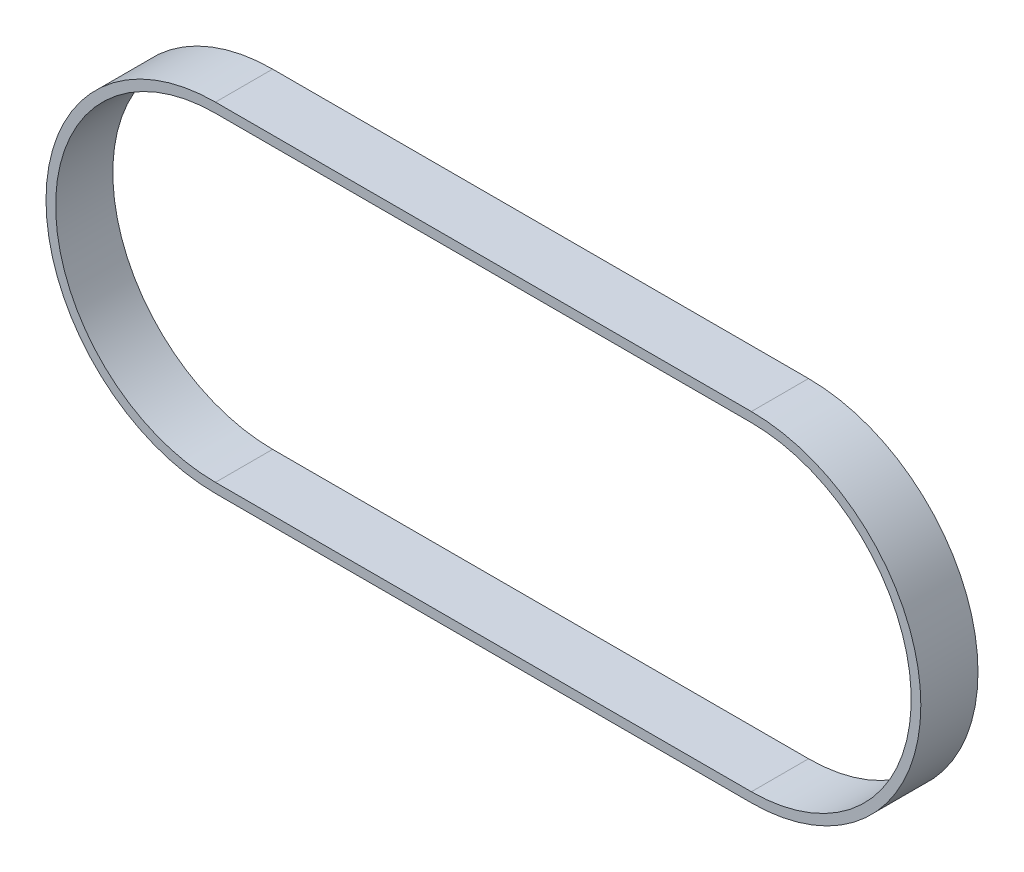
ISO-10303-21;
HEADER;
FILE_DESCRIPTION(('STEP AP214'),'2;1');
FILE_NAME('part.step','',(''),(''),'','','');
FILE_SCHEMA(('AUTOMOTIVE_DESIGN { 1 0 10303 214 1 1 1 1 }'));
ENDSEC;
DATA;
#1=APPLICATION_CONTEXT('core data for automotive mechanical design processes');
#2=APPLICATION_PROTOCOL_DEFINITION('international standard','automotive_design',2000,#1);
#3=PRODUCT_CONTEXT('',#1,'mechanical');
#4=PRODUCT('Part','Part','',(#3));
#5=PRODUCT_RELATED_PRODUCT_CATEGORY('part','',(#4));
#6=PRODUCT_DEFINITION_FORMATION('','',#4);
#7=PRODUCT_DEFINITION_CONTEXT('part definition',#1,'design');
#8=PRODUCT_DEFINITION('design','',#6,#7);
#9=PRODUCT_DEFINITION_SHAPE('','',#8);
#10=(LENGTH_UNIT() NAMED_UNIT(*) SI_UNIT(.MILLI.,.METRE.));
#11=(NAMED_UNIT(*) PLANE_ANGLE_UNIT() SI_UNIT($,.RADIAN.));
#12=(NAMED_UNIT(*) SI_UNIT($,.STERADIAN.) SOLID_ANGLE_UNIT());
#13=UNCERTAINTY_MEASURE_WITH_UNIT(LENGTH_MEASURE(1.E-05),#10,'distance_accuracy_value','');
#14=(GEOMETRIC_REPRESENTATION_CONTEXT(3) GLOBAL_UNCERTAINTY_ASSIGNED_CONTEXT((#13)) GLOBAL_UNIT_ASSIGNED_CONTEXT((#10,
#11,#12)) REPRESENTATION_CONTEXT('',''));
#15=CARTESIAN_POINT('',(0.,0.,0.));
#16=DIRECTION('',(0.,0.,1.));
#17=DIRECTION('',(1.,0.,0.));
#18=AXIS2_PLACEMENT_3D('',#15,#16,#17);
#19=CARTESIAN_POINT('',(-22.5,0.,4.8));
#20=DIRECTION('',(0.,0.,-1.));
#21=DIRECTION('',(-1.,0.,0.));
#22=AXIS2_PLACEMENT_3D('',#19,#20,#21);
#23=CYLINDRICAL_SURFACE('',#22,13.42);
#24=CARTESIAN_POINT('',(-22.5,0.,0.));
#25=DIRECTION('',(0.,0.,1.));
#26=DIRECTION('',(1.,0.,0.));
#27=AXIS2_PLACEMENT_3D('',#24,#25,#26);
#28=CIRCLE('',#27,13.42);
#29=CARTESIAN_POINT('',(-22.5,13.42,0.));
#30=VERTEX_POINT('',#29);
#31=CARTESIAN_POINT('',(-22.5,-13.42,0.));
#32=VERTEX_POINT('',#31);
#33=EDGE_CURVE('E199',#30,#32,#28,.T.);
#34=ORIENTED_EDGE('',*,*,#33,.F.);
#35=DIRECTION('',(0.,0.,-1.));
#36=VECTOR('',#35,1.);
#37=CARTESIAN_POINT('',(-22.5,13.42,4.8));
#38=LINE('',#37,#36);
#39=CARTESIAN_POINT('',(-22.5,13.42,4.8));
#40=VERTEX_POINT('',#39);
#41=EDGE_CURVE('E88',#40,#30,#38,.T.);
#42=ORIENTED_EDGE('',*,*,#41,.F.);
#43=CARTESIAN_POINT('',(-22.5,0.,4.8));
#44=DIRECTION('',(0.,0.,1.));
#45=DIRECTION('',(1.,0.,0.));
#46=AXIS2_PLACEMENT_3D('',#43,#44,#45);
#47=CIRCLE('',#46,13.42);
#48=CARTESIAN_POINT('',(-22.5,-13.42,4.8));
#49=VERTEX_POINT('',#48);
#50=EDGE_CURVE('E190',#40,#49,#47,.T.);
#51=ORIENTED_EDGE('',*,*,#50,.T.);
#52=DIRECTION('',(0.,0.,-1.));
#53=VECTOR('',#52,1.);
#54=CARTESIAN_POINT('',(-22.5,-13.42,4.8));
#55=LINE('',#54,#53);
#56=EDGE_CURVE('E95',#49,#32,#55,.T.);
#57=ORIENTED_EDGE('',*,*,#56,.T.);
#58=EDGE_LOOP('',(#34,#42,#51,#57));
#59=FACE_BOUND('',#58,.T.);
#60=ADVANCED_FACE('F80',(#59),#23,.F.);
#61=CARTESIAN_POINT('',(22.5,-13.42,4.8));
#62=DIRECTION('',(0.,1.,0.));
#63=DIRECTION('',(-1.,0.,0.));
#64=AXIS2_PLACEMENT_3D('',#61,#62,#63);
#65=PLANE('',#64);
#66=DIRECTION('',(1.,0.,0.));
#67=VECTOR('',#66,1.);
#68=CARTESIAN_POINT('',(22.5,-13.42,0.));
#69=LINE('',#68,#67);
#70=CARTESIAN_POINT('',(22.5,-13.42,0.));
#71=VERTEX_POINT('',#70);
#72=EDGE_CURVE('E188',#32,#71,#69,.T.);
#73=ORIENTED_EDGE('',*,*,#72,.F.);
#74=ORIENTED_EDGE('',*,*,#56,.F.);
#75=DIRECTION('',(1.,0.,0.));
#76=VECTOR('',#75,1.);
#77=CARTESIAN_POINT('',(22.5,-13.42,4.8));
#78=LINE('',#77,#76);
#79=CARTESIAN_POINT('',(22.5,-13.42,4.8));
#80=VERTEX_POINT('',#79);
#81=EDGE_CURVE('E192',#49,#80,#78,.T.);
#82=ORIENTED_EDGE('',*,*,#81,.T.);
#83=DIRECTION('',(0.,0.,-1.));
#84=VECTOR('',#83,1.);
#85=CARTESIAN_POINT('',(22.5,-13.42,4.8));
#86=LINE('',#85,#84);
#87=EDGE_CURVE('E194',#80,#71,#86,.T.);
#88=ORIENTED_EDGE('',*,*,#87,.T.);
#89=EDGE_LOOP('',(#73,#74,#82,#88));
#90=FACE_BOUND('',#89,.T.);
#91=ADVANCED_FACE('F215',(#90),#65,.T.);
#92=CARTESIAN_POINT('',(22.5,0.,4.8));
#93=DIRECTION('',(0.,0.,-1.));
#94=DIRECTION('',(-1.,0.,0.));
#95=AXIS2_PLACEMENT_3D('',#92,#93,#94);
#96=CYLINDRICAL_SURFACE('',#95,13.42);
#97=CARTESIAN_POINT('',(22.5,0.,0.));
#98=DIRECTION('',(0.,0.,1.));
#99=DIRECTION('',(1.,0.,0.));
#100=AXIS2_PLACEMENT_3D('',#97,#98,#99);
#101=CIRCLE('',#100,13.42);
#102=CARTESIAN_POINT('',(22.5,13.42,0.));
#103=VERTEX_POINT('',#102);
#104=EDGE_CURVE('E102',#71,#103,#101,.T.);
#105=ORIENTED_EDGE('',*,*,#104,.F.);
#106=ORIENTED_EDGE('',*,*,#87,.F.);
#107=CARTESIAN_POINT('',(22.5,0.,4.8));
#108=DIRECTION('',(0.,0.,1.));
#109=DIRECTION('',(1.,0.,0.));
#110=AXIS2_PLACEMENT_3D('',#107,#108,#109);
#111=CIRCLE('',#110,13.42);
#112=CARTESIAN_POINT('',(22.5,13.42,4.8));
#113=VERTEX_POINT('',#112);
#114=EDGE_CURVE('E185',#80,#113,#111,.T.);
#115=ORIENTED_EDGE('',*,*,#114,.T.);
#116=DIRECTION('',(0.,0.,-1.));
#117=VECTOR('',#116,1.);
#118=CARTESIAN_POINT('',(22.5,13.42,4.8));
#119=LINE('',#118,#117);
#120=EDGE_CURVE('E12',#113,#103,#119,.T.);
#121=ORIENTED_EDGE('',*,*,#120,.T.);
#122=EDGE_LOOP('',(#105,#106,#115,#121));
#123=FACE_BOUND('',#122,.T.);
#124=ADVANCED_FACE('F218',(#123),#96,.F.);
#125=CARTESIAN_POINT('',(22.5,13.42,4.8));
#126=DIRECTION('',(0.,-1.,0.));
#127=DIRECTION('',(1.,0.,0.));
#128=AXIS2_PLACEMENT_3D('',#125,#126,#127);
#129=PLANE('',#128);
#130=DIRECTION('',(-1.,0.,0.));
#131=VECTOR('',#130,1.);
#132=CARTESIAN_POINT('',(22.5,13.42,0.));
#133=LINE('',#132,#131);
#134=EDGE_CURVE('E196',#103,#30,#133,.T.);
#135=ORIENTED_EDGE('',*,*,#134,.F.);
#136=ORIENTED_EDGE('',*,*,#120,.F.);
#137=DIRECTION('',(-1.,0.,0.));
#138=VECTOR('',#137,1.);
#139=CARTESIAN_POINT('',(22.5,13.42,4.8));
#140=LINE('',#139,#138);
#141=EDGE_CURVE('E187',#113,#40,#140,.T.);
#142=ORIENTED_EDGE('',*,*,#141,.T.);
#143=ORIENTED_EDGE('',*,*,#41,.T.);
#144=EDGE_LOOP('',(#135,#136,#142,#143));
#145=FACE_BOUND('',#144,.T.);
#146=ADVANCED_FACE('F208',(#145),#129,.T.);
#147=CARTESIAN_POINT('',(22.5,0.,4.8));
#148=DIRECTION('',(0.,0.,1.));
#149=DIRECTION('',(1.,0.,0.));
#150=AXIS2_PLACEMENT_3D('',#147,#148,#149);
#151=PLANE('',#150);
#152=ORIENTED_EDGE('',*,*,#141,.F.);
#153=ORIENTED_EDGE('',*,*,#114,.F.);
#154=ORIENTED_EDGE('',*,*,#81,.F.);
#155=ORIENTED_EDGE('',*,*,#50,.F.);
#156=EDGE_LOOP('',(#152,#153,#154,#155));
#157=FACE_BOUND('',#156,.T.);
#158=CARTESIAN_POINT('',(22.5,0.,4.8));
#159=DIRECTION('',(0.,0.,1.));
#160=DIRECTION('',(1.,0.,0.));
#161=AXIS2_PLACEMENT_3D('',#158,#159,#160);
#162=CIRCLE('',#161,14.23);
#163=CARTESIAN_POINT('',(22.5,-14.23,4.8));
#164=VERTEX_POINT('',#163);
#165=CARTESIAN_POINT('',(22.5,14.23,4.8));
#166=VERTEX_POINT('',#165);
#167=EDGE_CURVE('E159',#164,#166,#162,.T.);
#168=ORIENTED_EDGE('',*,*,#167,.T.);
#169=DIRECTION('',(-1.,0.,0.));
#170=VECTOR('',#169,1.);
#171=CARTESIAN_POINT('',(22.5,14.23,4.8));
#172=LINE('',#171,#170);
#173=CARTESIAN_POINT('',(-22.5,14.23,4.8));
#174=VERTEX_POINT('',#173);
#175=EDGE_CURVE('E165',#166,#174,#172,.T.);
#176=ORIENTED_EDGE('',*,*,#175,.T.);
#177=CARTESIAN_POINT('',(-22.5,0.,4.8));
#178=DIRECTION('',(0.,0.,1.));
#179=DIRECTION('',(1.,0.,0.));
#180=AXIS2_PLACEMENT_3D('',#177,#178,#179);
#181=CIRCLE('',#180,14.23);
#182=CARTESIAN_POINT('',(-22.5,-14.23,4.8));
#183=VERTEX_POINT('',#182);
#184=EDGE_CURVE('E170',#174,#183,#181,.T.);
#185=ORIENTED_EDGE('',*,*,#184,.T.);
#186=DIRECTION('',(1.,0.,0.));
#187=VECTOR('',#186,1.);
#188=CARTESIAN_POINT('',(-22.5,-14.23,4.8));
#189=LINE('',#188,#187);
#190=EDGE_CURVE('E150',#183,#164,#189,.T.);
#191=ORIENTED_EDGE('',*,*,#190,.T.);
#192=EDGE_LOOP('',(#168,#176,#185,#191));
#193=FACE_BOUND('',#192,.T.);
#194=ADVANCED_FACE('F168',(#157,#193),#151,.T.);
#195=CARTESIAN_POINT('',(22.5,0.,0.));
#196=DIRECTION('',(0.,0.,1.));
#197=DIRECTION('',(1.,0.,0.));
#198=AXIS2_PLACEMENT_3D('',#195,#196,#197);
#199=PLANE('',#198);
#200=ORIENTED_EDGE('',*,*,#104,.T.);
#201=ORIENTED_EDGE('',*,*,#134,.T.);
#202=ORIENTED_EDGE('',*,*,#33,.T.);
#203=ORIENTED_EDGE('',*,*,#72,.T.);
#204=EDGE_LOOP('',(#200,#201,#202,#203));
#205=FACE_BOUND('',#204,.T.);
#206=CARTESIAN_POINT('',(22.5,0.,0.));
#207=DIRECTION('',(0.,0.,1.));
#208=DIRECTION('',(1.,0.,0.));
#209=AXIS2_PLACEMENT_3D('',#206,#207,#208);
#210=CIRCLE('',#209,14.23);
#211=CARTESIAN_POINT('',(22.5,-14.23,0.));
#212=VERTEX_POINT('',#211);
#213=CARTESIAN_POINT('',(22.5,14.23,0.));
#214=VERTEX_POINT('',#213);
#215=EDGE_CURVE('E171',#212,#214,#210,.T.);
#216=ORIENTED_EDGE('',*,*,#215,.F.);
#217=DIRECTION('',(1.,0.,0.));
#218=VECTOR('',#217,1.);
#219=CARTESIAN_POINT('',(-22.5,-14.23,0.));
#220=LINE('',#219,#218);
#221=CARTESIAN_POINT('',(-22.5,-14.23,0.));
#222=VERTEX_POINT('',#221);
#223=EDGE_CURVE('E152',#222,#212,#220,.T.);
#224=ORIENTED_EDGE('',*,*,#223,.F.);
#225=CARTESIAN_POINT('',(-22.5,0.,0.));
#226=DIRECTION('',(0.,0.,1.));
#227=DIRECTION('',(1.,0.,0.));
#228=AXIS2_PLACEMENT_3D('',#225,#226,#227);
#229=CIRCLE('',#228,14.23);
#230=CARTESIAN_POINT('',(-22.5,14.23,0.));
#231=VERTEX_POINT('',#230);
#232=EDGE_CURVE('E180',#231,#222,#229,.T.);
#233=ORIENTED_EDGE('',*,*,#232,.F.);
#234=DIRECTION('',(-1.,0.,0.));
#235=VECTOR('',#234,1.);
#236=CARTESIAN_POINT('',(22.5,14.23,0.));
#237=LINE('',#236,#235);
#238=EDGE_CURVE('E174',#214,#231,#237,.T.);
#239=ORIENTED_EDGE('',*,*,#238,.F.);
#240=EDGE_LOOP('',(#216,#224,#233,#239));
#241=FACE_BOUND('',#240,.T.);
#242=ADVANCED_FACE('F82',(#205,#241),#199,.F.);
#243=CARTESIAN_POINT('',(22.5,14.23,0.));
#244=DIRECTION('',(0.,1.,0.));
#245=DIRECTION('',(-1.,0.,0.));
#246=AXIS2_PLACEMENT_3D('',#243,#244,#245);
#247=PLANE('',#246);
#248=ORIENTED_EDGE('',*,*,#175,.F.);
#249=DIRECTION('',(0.,0.,1.));
#250=VECTOR('',#249,1.);
#251=CARTESIAN_POINT('',(22.5,14.23,0.));
#252=LINE('',#251,#250);
#253=EDGE_CURVE('E161',#214,#166,#252,.T.);
#254=ORIENTED_EDGE('',*,*,#253,.F.);
#255=ORIENTED_EDGE('',*,*,#238,.T.);
#256=DIRECTION('',(0.,0.,1.));
#257=VECTOR('',#256,1.);
#258=CARTESIAN_POINT('',(-22.5,14.23,0.));
#259=LINE('',#258,#257);
#260=EDGE_CURVE('E327',#231,#174,#259,.T.);
#261=ORIENTED_EDGE('',*,*,#260,.T.);
#262=EDGE_LOOP('',(#248,#254,#255,#261));
#263=FACE_BOUND('',#262,.T.);
#264=ADVANCED_FACE('F225',(#263),#247,.T.);
#265=CARTESIAN_POINT('',(-22.5,0.,0.));
#266=DIRECTION('',(0.,0.,1.));
#267=DIRECTION('',(1.,0.,0.));
#268=AXIS2_PLACEMENT_3D('',#265,#266,#267);
#269=CYLINDRICAL_SURFACE('',#268,14.23);
#270=ORIENTED_EDGE('',*,*,#184,.F.);
#271=ORIENTED_EDGE('',*,*,#260,.F.);
#272=ORIENTED_EDGE('',*,*,#232,.T.);
#273=DIRECTION('',(0.,0.,1.));
#274=VECTOR('',#273,1.);
#275=CARTESIAN_POINT('',(-22.5,-14.23,0.));
#276=LINE('',#275,#274);
#277=EDGE_CURVE('E156',#222,#183,#276,.T.);
#278=ORIENTED_EDGE('',*,*,#277,.T.);
#279=EDGE_LOOP('',(#270,#271,#272,#278));
#280=FACE_BOUND('',#279,.T.);
#281=ADVANCED_FACE('F236',(#280),#269,.T.);
#282=CARTESIAN_POINT('',(-22.5,-14.23,0.));
#283=DIRECTION('',(0.,-1.,0.));
#284=DIRECTION('',(1.,0.,0.));
#285=AXIS2_PLACEMENT_3D('',#282,#283,#284);
#286=PLANE('',#285);
#287=ORIENTED_EDGE('',*,*,#190,.F.);
#288=ORIENTED_EDGE('',*,*,#277,.F.);
#289=ORIENTED_EDGE('',*,*,#223,.T.);
#290=DIRECTION('',(0.,0.,1.));
#291=VECTOR('',#290,1.);
#292=CARTESIAN_POINT('',(22.5,-14.23,0.));
#293=LINE('',#292,#291);
#294=EDGE_CURVE('E146',#212,#164,#293,.T.);
#295=ORIENTED_EDGE('',*,*,#294,.T.);
#296=EDGE_LOOP('',(#287,#288,#289,#295));
#297=FACE_BOUND('',#296,.T.);
#298=ADVANCED_FACE('F148',(#297),#286,.T.);
#299=CARTESIAN_POINT('',(22.5,0.,0.));
#300=DIRECTION('',(0.,0.,1.));
#301=DIRECTION('',(1.,0.,0.));
#302=AXIS2_PLACEMENT_3D('',#299,#300,#301);
#303=CYLINDRICAL_SURFACE('',#302,14.23);
#304=ORIENTED_EDGE('',*,*,#167,.F.);
#305=ORIENTED_EDGE('',*,*,#294,.F.);
#306=ORIENTED_EDGE('',*,*,#215,.T.);
#307=ORIENTED_EDGE('',*,*,#253,.T.);
#308=EDGE_LOOP('',(#304,#305,#306,#307));
#309=FACE_BOUND('',#308,.T.);
#310=ADVANCED_FACE('F160',(#309),#303,.T.);
#311=CLOSED_SHELL('',(#60,#91,#124,#146,#194,#242,#264,#281,#298,#310));
#312=MANIFOLD_SOLID_BREP('B2',#311);
#313=ADVANCED_BREP_SHAPE_REPRESENTATION('',(#18,#312),#14);
#314=SHAPE_DEFINITION_REPRESENTATION(#9,#313);
ENDSEC;
END-ISO-10303-21;
